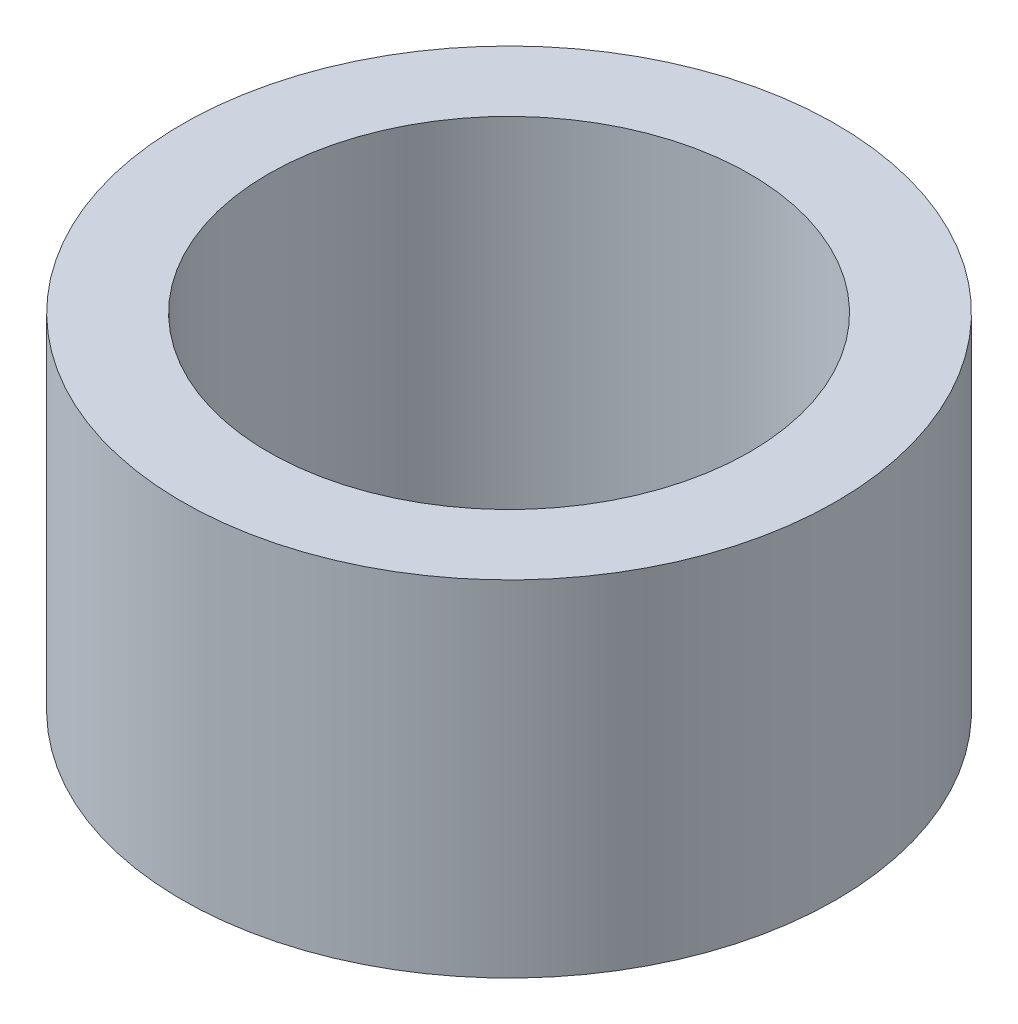
ISO-10303-21;
HEADER;
FILE_DESCRIPTION(('STEP AP214'),'2;1');
FILE_NAME('part.step','',(''),(''),'','','');
FILE_SCHEMA(('AUTOMOTIVE_DESIGN { 1 0 10303 214 1 1 1 1 }'));
ENDSEC;
DATA;
#1=APPLICATION_CONTEXT('core data for automotive mechanical design processes');
#2=APPLICATION_PROTOCOL_DEFINITION('international standard','automotive_design',2000,#1);
#3=PRODUCT_CONTEXT('',#1,'mechanical');
#4=PRODUCT('Part','Part','',(#3));
#5=PRODUCT_RELATED_PRODUCT_CATEGORY('part','',(#4));
#6=PRODUCT_DEFINITION_FORMATION('','',#4);
#7=PRODUCT_DEFINITION_CONTEXT('part definition',#1,'design');
#8=PRODUCT_DEFINITION('design','',#6,#7);
#9=PRODUCT_DEFINITION_SHAPE('','',#8);
#10=(LENGTH_UNIT() NAMED_UNIT(*) SI_UNIT(.MILLI.,.METRE.));
#11=(NAMED_UNIT(*) PLANE_ANGLE_UNIT() SI_UNIT($,.RADIAN.));
#12=(NAMED_UNIT(*) SI_UNIT($,.STERADIAN.) SOLID_ANGLE_UNIT());
#13=UNCERTAINTY_MEASURE_WITH_UNIT(LENGTH_MEASURE(1.E-05),#10,'distance_accuracy_value','');
#14=(GEOMETRIC_REPRESENTATION_CONTEXT(3) GLOBAL_UNCERTAINTY_ASSIGNED_CONTEXT((#13)) GLOBAL_UNIT_ASSIGNED_CONTEXT((#10,
#11,#12)) REPRESENTATION_CONTEXT('',''));
#15=CARTESIAN_POINT('',(0.,0.,0.));
#16=DIRECTION('',(0.,0.,1.));
#17=DIRECTION('',(1.,0.,0.));
#18=AXIS2_PLACEMENT_3D('',#15,#16,#17);
#19=CARTESIAN_POINT('',(240.,173.,75.));
#20=DIRECTION('',(0.,-1.,0.));
#21=DIRECTION('',(1.,0.,0.));
#22=AXIS2_PLACEMENT_3D('',#19,#20,#21);
#23=CYLINDRICAL_SURFACE('',#22,4.05);
#24=DIRECTION('',(0.,-1.,0.));
#25=VECTOR('',#24,1.);
#26=CARTESIAN_POINT('',(244.05,173.,75.));
#27=LINE('',#26,#25);
#28=CARTESIAN_POINT('',(244.05,172.9,75.));
#29=VERTEX_POINT('',#28);
#30=CARTESIAN_POINT('',(244.05,167.1,75.));
#31=VERTEX_POINT('',#30);
#32=EDGE_CURVE('E11',#29,#31,#27,.T.);
#33=ORIENTED_EDGE('',*,*,#32,.F.);
#34=CARTESIAN_POINT('',(240.,172.9,75.));
#35=DIRECTION('',(0.,-1.,0.));
#36=DIRECTION('',(1.,0.,0.));
#37=AXIS2_PLACEMENT_3D('',#34,#35,#36);
#38=CIRCLE('',#37,4.05);
#39=EDGE_CURVE('E24',#29,#29,#38,.T.);
#40=ORIENTED_EDGE('',*,*,#39,.F.);
#41=ORIENTED_EDGE('',*,*,#32,.T.);
#42=CARTESIAN_POINT('',(240.,167.1,75.));
#43=DIRECTION('',(0.,-1.,0.));
#44=DIRECTION('',(1.,0.,0.));
#45=AXIS2_PLACEMENT_3D('',#42,#43,#44);
#46=CIRCLE('',#45,4.05);
#47=EDGE_CURVE('E66',#31,#31,#46,.T.);
#48=ORIENTED_EDGE('',*,*,#47,.T.);
#49=EDGE_LOOP('',(#33,#40,#41,#48));
#50=FACE_BOUND('',#49,.T.);
#51=ADVANCED_FACE('F16',(#50),#23,.F.);
#52=CARTESIAN_POINT('',(240.,172.9,75.));
#53=DIRECTION('',(0.,-1.,0.));
#54=DIRECTION('',(-1.,0.,0.));
#55=AXIS2_PLACEMENT_3D('',#52,#53,#54);
#56=PLANE('',#55);
#57=ORIENTED_EDGE('',*,*,#39,.T.);
#58=EDGE_LOOP('',(#57));
#59=FACE_BOUND('',#58,.T.);
#60=CARTESIAN_POINT('',(240.,172.9,75.));
#61=DIRECTION('',(0.,-1.,0.));
#62=DIRECTION('',(1.,0.,0.));
#63=AXIS2_PLACEMENT_3D('',#60,#61,#62);
#64=CIRCLE('',#63,5.5);
#65=CARTESIAN_POINT('',(245.5,172.9,75.));
#66=VERTEX_POINT('',#65);
#67=EDGE_CURVE('E55',#66,#66,#64,.T.);
#68=ORIENTED_EDGE('',*,*,#67,.F.);
#69=EDGE_LOOP('',(#68));
#70=FACE_BOUND('',#69,.T.);
#71=ADVANCED_FACE('F71',(#59,#70),#56,.F.);
#72=CARTESIAN_POINT('',(240.,167.1,75.));
#73=DIRECTION('',(0.,-1.,0.));
#74=DIRECTION('',(-1.,0.,0.));
#75=AXIS2_PLACEMENT_3D('',#72,#73,#74);
#76=PLANE('',#75);
#77=ORIENTED_EDGE('',*,*,#47,.F.);
#78=EDGE_LOOP('',(#77));
#79=FACE_BOUND('',#78,.T.);
#80=CARTESIAN_POINT('',(240.,167.1,75.));
#81=DIRECTION('',(0.,-1.,0.));
#82=DIRECTION('',(1.,0.,0.));
#83=AXIS2_PLACEMENT_3D('',#80,#81,#82);
#84=CIRCLE('',#83,5.5);
#85=CARTESIAN_POINT('',(245.5,167.1,75.));
#86=VERTEX_POINT('',#85);
#87=EDGE_CURVE('E53',#86,#86,#84,.T.);
#88=ORIENTED_EDGE('',*,*,#87,.T.);
#89=EDGE_LOOP('',(#88));
#90=FACE_BOUND('',#89,.T.);
#91=ADVANCED_FACE('F59',(#79,#90),#76,.T.);
#92=CARTESIAN_POINT('',(240.,172.9,75.));
#93=DIRECTION('',(0.,-1.,0.));
#94=DIRECTION('',(1.,0.,0.));
#95=AXIS2_PLACEMENT_3D('',#92,#93,#94);
#96=CYLINDRICAL_SURFACE('',#95,5.5);
#97=ORIENTED_EDGE('',*,*,#87,.F.);
#98=DIRECTION('',(0.,-1.,0.));
#99=VECTOR('',#98,1.);
#100=CARTESIAN_POINT('',(245.5,172.9,75.));
#101=LINE('',#100,#99);
#102=EDGE_CURVE('E50',#66,#86,#101,.T.);
#103=ORIENTED_EDGE('',*,*,#102,.F.);
#104=ORIENTED_EDGE('',*,*,#67,.T.);
#105=ORIENTED_EDGE('',*,*,#102,.T.);
#106=EDGE_LOOP('',(#97,#103,#104,#105));
#107=FACE_BOUND('',#106,.T.);
#108=ADVANCED_FACE('F52',(#107),#96,.T.);
#109=CLOSED_SHELL('',(#51,#71,#91,#108));
#110=MANIFOLD_SOLID_BREP('B1',#109);
#111=ADVANCED_BREP_SHAPE_REPRESENTATION('',(#18,#110),#14);
#112=SHAPE_DEFINITION_REPRESENTATION(#9,#111);
ENDSEC;
END-ISO-10303-21;
